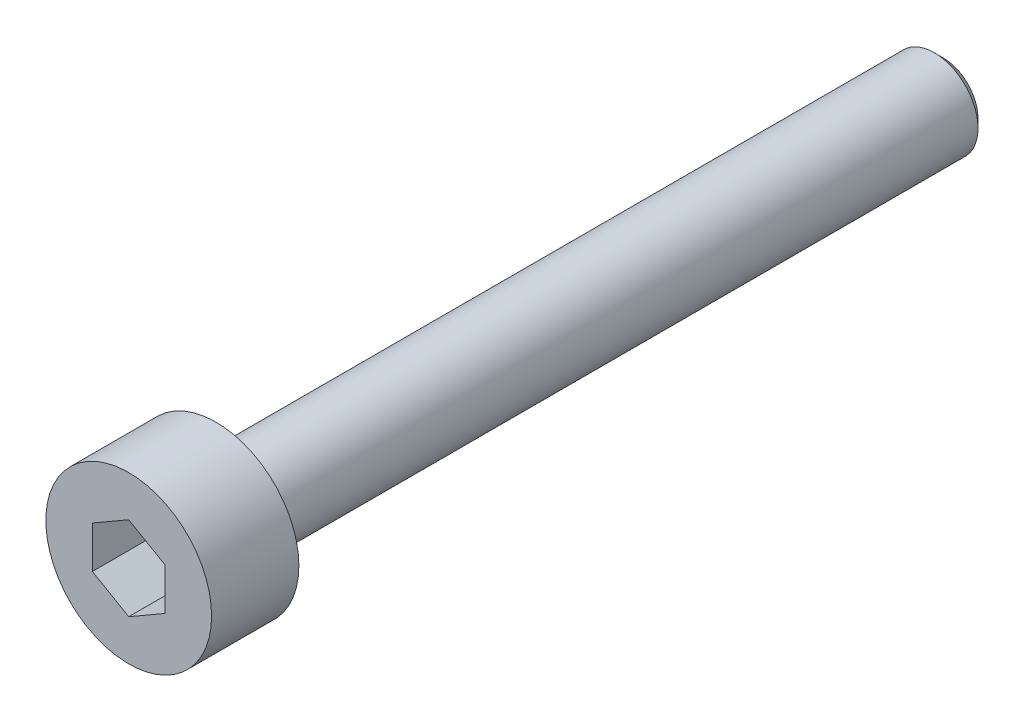
ISO-10303-21;
HEADER;
FILE_DESCRIPTION(('STEP AP214'),'2;1');
FILE_NAME('part.step','',(''),(''),'','','');
FILE_SCHEMA(('AUTOMOTIVE_DESIGN { 1 0 10303 214 1 1 1 1 }'));
ENDSEC;
DATA;
#1=APPLICATION_CONTEXT('core data for automotive mechanical design processes');
#2=APPLICATION_PROTOCOL_DEFINITION('international standard','automotive_design',2000,#1);
#3=PRODUCT_CONTEXT('',#1,'mechanical');
#4=PRODUCT('Part','Part','',(#3));
#5=PRODUCT_RELATED_PRODUCT_CATEGORY('part','',(#4));
#6=PRODUCT_DEFINITION_FORMATION('','',#4);
#7=PRODUCT_DEFINITION_CONTEXT('part definition',#1,'design');
#8=PRODUCT_DEFINITION('design','',#6,#7);
#9=PRODUCT_DEFINITION_SHAPE('','',#8);
#10=(LENGTH_UNIT() NAMED_UNIT(*) SI_UNIT(.MILLI.,.METRE.));
#11=(NAMED_UNIT(*) PLANE_ANGLE_UNIT() SI_UNIT($,.RADIAN.));
#12=(NAMED_UNIT(*) SI_UNIT($,.STERADIAN.) SOLID_ANGLE_UNIT());
#13=UNCERTAINTY_MEASURE_WITH_UNIT(LENGTH_MEASURE(1.E-05),#10,'distance_accuracy_value','');
#14=(GEOMETRIC_REPRESENTATION_CONTEXT(3) GLOBAL_UNCERTAINTY_ASSIGNED_CONTEXT((#13)) GLOBAL_UNIT_ASSIGNED_CONTEXT((#10,
#11,#12)) REPRESENTATION_CONTEXT('',''));
#15=CARTESIAN_POINT('',(0.,0.,0.));
#16=DIRECTION('',(0.,0.,1.));
#17=DIRECTION('',(1.,0.,0.));
#18=AXIS2_PLACEMENT_3D('',#15,#16,#17);
#19=CARTESIAN_POINT('',(0.,0.,0.));
#20=DIRECTION('',(0.,0.,1.));
#21=DIRECTION('',(1.,0.,0.));
#22=AXIS2_PLACEMENT_3D('',#19,#20,#21);
#23=PLANE('',#22);
#24=CARTESIAN_POINT('',(0.,0.,0.));
#25=DIRECTION('',(0.,0.,1.));
#26=DIRECTION('',(1.,0.,0.));
#27=AXIS2_PLACEMENT_3D('',#24,#25,#26);
#28=CIRCLE('',#27,2.85);
#29=CARTESIAN_POINT('',(2.85,0.,0.));
#30=VERTEX_POINT('',#29);
#31=EDGE_CURVE('E138',#30,#30,#28,.T.);
#32=ORIENTED_EDGE('',*,*,#31,.F.);
#33=EDGE_LOOP('',(#32));
#34=FACE_BOUND('',#33,.T.);
#35=CARTESIAN_POINT('',(0.,0.,0.));
#36=DIRECTION('',(0.,0.,1.));
#37=DIRECTION('',(1.,0.,0.));
#38=AXIS2_PLACEMENT_3D('',#35,#36,#37);
#39=CIRCLE('',#38,1.5);
#40=CARTESIAN_POINT('',(1.5,0.,0.));
#41=VERTEX_POINT('',#40);
#42=EDGE_CURVE('E147',#41,#41,#39,.F.);
#43=ORIENTED_EDGE('',*,*,#42,.F.);
#44=EDGE_LOOP('',(#43));
#45=FACE_BOUND('',#44,.T.);
#46=ADVANCED_FACE('F36',(#34,#45),#23,.F.);
#47=CARTESIAN_POINT('',(0.,0.,3.));
#48=DIRECTION('',(0.,0.,-1.));
#49=DIRECTION('',(-1.,0.,0.));
#50=AXIS2_PLACEMENT_3D('',#47,#48,#49);
#51=CYLINDRICAL_SURFACE('',#50,2.85);
#52=CARTESIAN_POINT('',(0.,0.,3.));
#53=DIRECTION('',(0.,0.,1.));
#54=DIRECTION('',(1.,0.,0.));
#55=AXIS2_PLACEMENT_3D('',#52,#53,#54);
#56=CIRCLE('',#55,2.85);
#57=CARTESIAN_POINT('',(2.85,0.,3.));
#58=VERTEX_POINT('',#57);
#59=EDGE_CURVE('E144',#58,#58,#56,.T.);
#60=ORIENTED_EDGE('',*,*,#59,.F.);
#61=EDGE_LOOP('',(#60));
#62=FACE_BOUND('',#61,.T.);
#63=ORIENTED_EDGE('',*,*,#31,.T.);
#64=EDGE_LOOP('',(#63));
#65=FACE_BOUND('',#64,.T.);
#66=ADVANCED_FACE('F169',(#62,#65),#51,.T.);
#67=CARTESIAN_POINT('',(0.,0.,3.));
#68=DIRECTION('',(0.,0.,1.));
#69=DIRECTION('',(1.,0.,0.));
#70=AXIS2_PLACEMENT_3D('',#67,#68,#69);
#71=PLANE('',#70);
#72=DIRECTION('',(-0.866025403784439,0.5,0.));
#73=VECTOR('',#72,1.);
#74=CARTESIAN_POINT('',(1.25,0.721687836487032,3.));
#75=LINE('',#74,#73);
#76=CARTESIAN_POINT('',(1.25,0.721687836487032,3.));
#77=VERTEX_POINT('',#76);
#78=CARTESIAN_POINT('',(0.,1.44337567297406,3.));
#79=VERTEX_POINT('',#78);
#80=EDGE_CURVE('E51',#77,#79,#75,.T.);
#81=ORIENTED_EDGE('',*,*,#80,.F.);
#82=DIRECTION('',(0.,1.,0.));
#83=VECTOR('',#82,1.);
#84=CARTESIAN_POINT('',(1.25,-0.721687836487032,3.));
#85=LINE('',#84,#83);
#86=CARTESIAN_POINT('',(1.25,-0.721687836487032,3.));
#87=VERTEX_POINT('',#86);
#88=EDGE_CURVE('E134',#87,#77,#85,.T.);
#89=ORIENTED_EDGE('',*,*,#88,.F.);
#90=DIRECTION('',(0.866025403784439,0.5,0.));
#91=VECTOR('',#90,1.);
#92=CARTESIAN_POINT('',(0.,-1.44337567297406,3.));
#93=LINE('',#92,#91);
#94=CARTESIAN_POINT('',(0.,-1.44337567297406,3.));
#95=VERTEX_POINT('',#94);
#96=EDGE_CURVE('E132',#95,#87,#93,.T.);
#97=ORIENTED_EDGE('',*,*,#96,.F.);
#98=DIRECTION('',(0.866025403784439,-0.5,0.));
#99=VECTOR('',#98,1.);
#100=CARTESIAN_POINT('',(-1.25,-0.721687836487033,3.));
#101=LINE('',#100,#99);
#102=CARTESIAN_POINT('',(-1.25,-0.721687836487033,3.));
#103=VERTEX_POINT('',#102);
#104=EDGE_CURVE('E99',#103,#95,#101,.T.);
#105=ORIENTED_EDGE('',*,*,#104,.F.);
#106=DIRECTION('',(0.,-1.,0.));
#107=VECTOR('',#106,1.);
#108=CARTESIAN_POINT('',(-1.25,0.721687836487032,3.));
#109=LINE('',#108,#107);
#110=CARTESIAN_POINT('',(-1.25,0.721687836487032,3.));
#111=VERTEX_POINT('',#110);
#112=EDGE_CURVE('E128',#111,#103,#109,.T.);
#113=ORIENTED_EDGE('',*,*,#112,.F.);
#114=DIRECTION('',(-0.866025403784439,-0.5,0.));
#115=VECTOR('',#114,1.);
#116=CARTESIAN_POINT('',(0.,1.44337567297406,3.));
#117=LINE('',#116,#115);
#118=EDGE_CURVE('E125',#79,#111,#117,.T.);
#119=ORIENTED_EDGE('',*,*,#118,.F.);
#120=EDGE_LOOP('',(#81,#89,#97,#105,#113,#119));
#121=FACE_BOUND('',#120,.T.);
#122=ORIENTED_EDGE('',*,*,#59,.T.);
#123=EDGE_LOOP('',(#122));
#124=FACE_BOUND('',#123,.T.);
#125=ADVANCED_FACE('F175',(#121,#124),#71,.T.);
#126=CARTESIAN_POINT('',(0.,0.,-25.));
#127=DIRECTION('',(0.,0.,1.));
#128=DIRECTION('',(1.,0.,0.));
#129=AXIS2_PLACEMENT_3D('',#126,#127,#128);
#130=CYLINDRICAL_SURFACE('',#129,1.5);
#131=CARTESIAN_POINT('',(0.,0.,-24.7));
#132=DIRECTION('',(0.,0.,-1.));
#133=DIRECTION('',(-1.,0.,0.));
#134=AXIS2_PLACEMENT_3D('',#131,#132,#133);
#135=CIRCLE('',#134,1.5);
#136=CARTESIAN_POINT('',(-1.5,0.,-24.7));
#137=VERTEX_POINT('',#136);
#138=EDGE_CURVE('E11',#137,#137,#135,.F.);
#139=ORIENTED_EDGE('',*,*,#138,.T.);
#140=EDGE_LOOP('',(#139));
#141=FACE_BOUND('',#140,.T.);
#142=ORIENTED_EDGE('',*,*,#42,.T.);
#143=EDGE_LOOP('',(#142));
#144=FACE_BOUND('',#143,.T.);
#145=ADVANCED_FACE('F165',(#141,#144),#130,.T.);
#146=CARTESIAN_POINT('',(0.,0.,-25.));
#147=DIRECTION('',(0.,0.,-1.));
#148=DIRECTION('',(-1.,0.,0.));
#149=AXIS2_PLACEMENT_3D('',#146,#147,#148);
#150=PLANE('',#149);
#151=CARTESIAN_POINT('',(0.,0.,-25.));
#152=DIRECTION('',(0.,0.,-1.));
#153=DIRECTION('',(-1.,0.,0.));
#154=AXIS2_PLACEMENT_3D('',#151,#152,#153);
#155=CIRCLE('',#154,1.2);
#156=CARTESIAN_POINT('',(-1.2,0.,-25.));
#157=VERTEX_POINT('',#156);
#158=EDGE_CURVE('E44',#157,#157,#155,.T.);
#159=ORIENTED_EDGE('',*,*,#158,.T.);
#160=EDGE_LOOP('',(#159));
#161=FACE_BOUND('',#160,.T.);
#162=ADVANCED_FACE('F154',(#161),#150,.T.);
#163=CARTESIAN_POINT('',(0.,0.,-25.));
#164=DIRECTION('',(0.,0.,1.));
#165=DIRECTION('',(1.,0.,0.));
#166=AXIS2_PLACEMENT_3D('',#163,#164,#165);
#167=CONICAL_SURFACE('',#166,1.2,0.785398163397447);
#168=ORIENTED_EDGE('',*,*,#138,.F.);
#169=EDGE_LOOP('',(#168));
#170=FACE_BOUND('',#169,.T.);
#171=ORIENTED_EDGE('',*,*,#158,.F.);
#172=EDGE_LOOP('',(#171));
#173=FACE_BOUND('',#172,.T.);
#174=ADVANCED_FACE('F38',(#170,#173),#167,.T.);
#175=CARTESIAN_POINT('',(1.25,0.721687836487032,1.));
#176=DIRECTION('',(0.5,0.866025403784439,0.));
#177=DIRECTION('',(-0.866025403784439,0.5,0.));
#178=AXIS2_PLACEMENT_3D('',#175,#176,#177);
#179=PLANE('',#178);
#180=ORIENTED_EDGE('',*,*,#80,.T.);
#181=DIRECTION('',(0.,0.,1.));
#182=VECTOR('',#181,1.);
#183=CARTESIAN_POINT('',(0.,1.44337567297406,1.));
#184=LINE('',#183,#182);
#185=CARTESIAN_POINT('',(0.,1.44337567297406,1.));
#186=VERTEX_POINT('',#185);
#187=EDGE_CURVE('E81',#186,#79,#184,.T.);
#188=ORIENTED_EDGE('',*,*,#187,.F.);
#189=DIRECTION('',(-0.866025403784439,0.5,0.));
#190=VECTOR('',#189,1.);
#191=CARTESIAN_POINT('',(1.25,0.721687836487032,1.));
#192=LINE('',#191,#190);
#193=CARTESIAN_POINT('',(1.25,0.721687836487032,1.));
#194=VERTEX_POINT('',#193);
#195=EDGE_CURVE('E136',#194,#186,#192,.T.);
#196=ORIENTED_EDGE('',*,*,#195,.F.);
#197=DIRECTION('',(0.,0.,1.));
#198=VECTOR('',#197,1.);
#199=CARTESIAN_POINT('',(1.25,0.721687836487032,1.));
#200=LINE('',#199,#198);
#201=EDGE_CURVE('E59',#194,#77,#200,.T.);
#202=ORIENTED_EDGE('',*,*,#201,.T.);
#203=EDGE_LOOP('',(#180,#188,#196,#202));
#204=FACE_BOUND('',#203,.T.);
#205=ADVANCED_FACE('F157',(#204),#179,.F.);
#206=CARTESIAN_POINT('',(1.25,-0.721687836487032,1.));
#207=DIRECTION('',(1.,0.,0.));
#208=DIRECTION('',(0.,1.,0.));
#209=AXIS2_PLACEMENT_3D('',#206,#207,#208);
#210=PLANE('',#209);
#211=ORIENTED_EDGE('',*,*,#88,.T.);
#212=ORIENTED_EDGE('',*,*,#201,.F.);
#213=DIRECTION('',(0.,1.,0.));
#214=VECTOR('',#213,1.);
#215=CARTESIAN_POINT('',(1.25,-0.721687836487032,1.));
#216=LINE('',#215,#214);
#217=CARTESIAN_POINT('',(1.25,-0.721687836487032,1.));
#218=VERTEX_POINT('',#217);
#219=EDGE_CURVE('E111',#218,#194,#216,.T.);
#220=ORIENTED_EDGE('',*,*,#219,.F.);
#221=DIRECTION('',(0.,0.,1.));
#222=VECTOR('',#221,1.);
#223=CARTESIAN_POINT('',(1.25,-0.721687836487032,1.));
#224=LINE('',#223,#222);
#225=EDGE_CURVE('E103',#218,#87,#224,.T.);
#226=ORIENTED_EDGE('',*,*,#225,.T.);
#227=EDGE_LOOP('',(#211,#212,#220,#226));
#228=FACE_BOUND('',#227,.T.);
#229=ADVANCED_FACE('F163',(#228),#210,.F.);
#230=CARTESIAN_POINT('',(0.,-1.44337567297406,1.));
#231=DIRECTION('',(0.5,-0.866025403784439,0.));
#232=DIRECTION('',(0.866025403784439,0.5,0.));
#233=AXIS2_PLACEMENT_3D('',#230,#231,#232);
#234=PLANE('',#233);
#235=ORIENTED_EDGE('',*,*,#96,.T.);
#236=ORIENTED_EDGE('',*,*,#225,.F.);
#237=DIRECTION('',(0.866025403784439,0.5,0.));
#238=VECTOR('',#237,1.);
#239=CARTESIAN_POINT('',(0.,-1.44337567297406,1.));
#240=LINE('',#239,#238);
#241=CARTESIAN_POINT('',(0.,-1.44337567297406,1.));
#242=VERTEX_POINT('',#241);
#243=EDGE_CURVE('E107',#242,#218,#240,.T.);
#244=ORIENTED_EDGE('',*,*,#243,.F.);
#245=DIRECTION('',(0.,0.,1.));
#246=VECTOR('',#245,1.);
#247=CARTESIAN_POINT('',(0.,-1.44337567297406,1.));
#248=LINE('',#247,#246);
#249=EDGE_CURVE('E92',#242,#95,#248,.T.);
#250=ORIENTED_EDGE('',*,*,#249,.T.);
#251=EDGE_LOOP('',(#235,#236,#244,#250));
#252=FACE_BOUND('',#251,.T.);
#253=ADVANCED_FACE('F108',(#252),#234,.F.);
#254=CARTESIAN_POINT('',(-1.25,-0.721687836487033,1.));
#255=DIRECTION('',(-0.5,-0.866025403784439,0.));
#256=DIRECTION('',(0.866025403784439,-0.5,0.));
#257=AXIS2_PLACEMENT_3D('',#254,#255,#256);
#258=PLANE('',#257);
#259=ORIENTED_EDGE('',*,*,#104,.T.);
#260=ORIENTED_EDGE('',*,*,#249,.F.);
#261=DIRECTION('',(0.866025403784439,-0.5,0.));
#262=VECTOR('',#261,1.);
#263=CARTESIAN_POINT('',(-1.25,-0.721687836487033,1.));
#264=LINE('',#263,#262);
#265=CARTESIAN_POINT('',(-1.25,-0.721687836487033,1.));
#266=VERTEX_POINT('',#265);
#267=EDGE_CURVE('E96',#266,#242,#264,.T.);
#268=ORIENTED_EDGE('',*,*,#267,.F.);
#269=DIRECTION('',(0.,0.,1.));
#270=VECTOR('',#269,1.);
#271=CARTESIAN_POINT('',(-1.25,-0.721687836487033,1.));
#272=LINE('',#271,#270);
#273=EDGE_CURVE('E104',#266,#103,#272,.T.);
#274=ORIENTED_EDGE('',*,*,#273,.T.);
#275=EDGE_LOOP('',(#259,#260,#268,#274));
#276=FACE_BOUND('',#275,.T.);
#277=ADVANCED_FACE('F94',(#276),#258,.F.);
#278=CARTESIAN_POINT('',(-1.25,0.721687836487032,1.));
#279=DIRECTION('',(-1.,0.,0.));
#280=DIRECTION('',(0.,0.,1.));
#281=AXIS2_PLACEMENT_3D('',#278,#279,#280);
#282=PLANE('',#281);
#283=ORIENTED_EDGE('',*,*,#112,.T.);
#284=ORIENTED_EDGE('',*,*,#273,.F.);
#285=DIRECTION('',(0.,-1.,0.));
#286=VECTOR('',#285,1.);
#287=CARTESIAN_POINT('',(-1.25,0.721687836487032,1.));
#288=LINE('',#287,#286);
#289=CARTESIAN_POINT('',(-1.25,0.721687836487032,1.));
#290=VERTEX_POINT('',#289);
#291=EDGE_CURVE('E117',#290,#266,#288,.T.);
#292=ORIENTED_EDGE('',*,*,#291,.F.);
#293=DIRECTION('',(0.,0.,1.));
#294=VECTOR('',#293,1.);
#295=CARTESIAN_POINT('',(-1.25,0.721687836487032,1.));
#296=LINE('',#295,#294);
#297=EDGE_CURVE('E141',#290,#111,#296,.T.);
#298=ORIENTED_EDGE('',*,*,#297,.T.);
#299=EDGE_LOOP('',(#283,#284,#292,#298));
#300=FACE_BOUND('',#299,.T.);
#301=ADVANCED_FACE('F189',(#300),#282,.F.);
#302=CARTESIAN_POINT('',(0.,1.44337567297406,1.));
#303=DIRECTION('',(-0.5,0.866025403784439,0.));
#304=DIRECTION('',(-0.866025403784439,-0.5,0.));
#305=AXIS2_PLACEMENT_3D('',#302,#303,#304);
#306=PLANE('',#305);
#307=ORIENTED_EDGE('',*,*,#118,.T.);
#308=ORIENTED_EDGE('',*,*,#297,.F.);
#309=DIRECTION('',(-0.866025403784439,-0.5,0.));
#310=VECTOR('',#309,1.);
#311=CARTESIAN_POINT('',(0.,1.44337567297406,1.));
#312=LINE('',#311,#310);
#313=EDGE_CURVE('E119',#186,#290,#312,.T.);
#314=ORIENTED_EDGE('',*,*,#313,.F.);
#315=ORIENTED_EDGE('',*,*,#187,.T.);
#316=EDGE_LOOP('',(#307,#308,#314,#315));
#317=FACE_BOUND('',#316,.T.);
#318=ADVANCED_FACE('F186',(#317),#306,.F.);
#319=CARTESIAN_POINT('',(0.,0.,1.));
#320=DIRECTION('',(0.,0.,1.));
#321=DIRECTION('',(1.,0.,0.));
#322=AXIS2_PLACEMENT_3D('',#319,#320,#321);
#323=PLANE('',#322);
#324=ORIENTED_EDGE('',*,*,#195,.T.);
#325=ORIENTED_EDGE('',*,*,#313,.T.);
#326=ORIENTED_EDGE('',*,*,#291,.T.);
#327=ORIENTED_EDGE('',*,*,#267,.T.);
#328=ORIENTED_EDGE('',*,*,#243,.T.);
#329=ORIENTED_EDGE('',*,*,#219,.T.);
#330=EDGE_LOOP('',(#324,#325,#326,#327,#328,#329));
#331=FACE_BOUND('',#330,.T.);
#332=ADVANCED_FACE('F114',(#331),#323,.T.);
#333=CLOSED_SHELL('',(#46,#66,#125,#145,#162,#174,#205,#229,#253,#277,#301,#318,#332));
#334=MANIFOLD_SOLID_BREP('B2',#333);
#335=ADVANCED_BREP_SHAPE_REPRESENTATION('',(#18,#334),#14);
#336=SHAPE_DEFINITION_REPRESENTATION(#9,#335);
ENDSEC;
END-ISO-10303-21;
